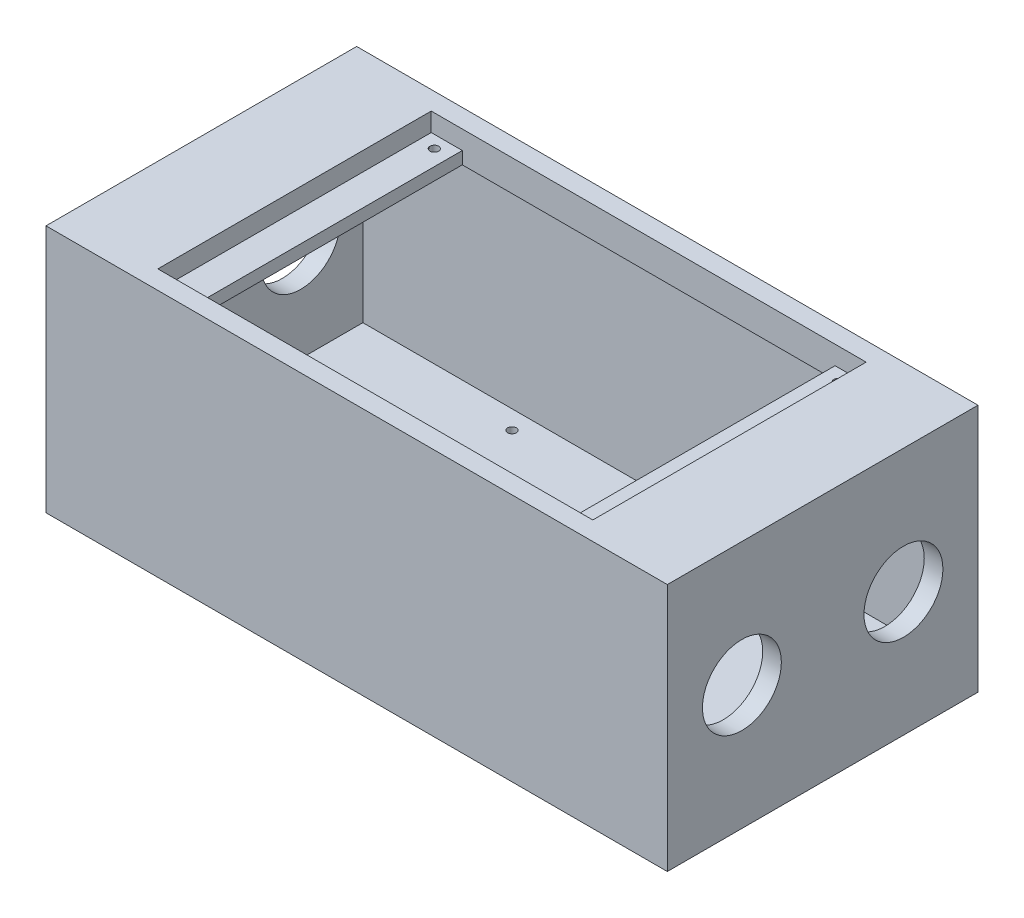
ISO-10303-21;
HEADER;
FILE_DESCRIPTION(('STEP AP214'),'2;1');
FILE_NAME('part.step','',(''),(''),'','','');
FILE_SCHEMA(('AUTOMOTIVE_DESIGN { 1 0 10303 214 1 1 1 1 }'));
ENDSEC;
DATA;
#1=APPLICATION_CONTEXT('core data for automotive mechanical design processes');
#2=APPLICATION_PROTOCOL_DEFINITION('international standard','automotive_design',2000,#1);
#3=PRODUCT_CONTEXT('',#1,'mechanical');
#4=PRODUCT('Part','Part','',(#3));
#5=PRODUCT_RELATED_PRODUCT_CATEGORY('part','',(#4));
#6=PRODUCT_DEFINITION_FORMATION('','',#4);
#7=PRODUCT_DEFINITION_CONTEXT('part definition',#1,'design');
#8=PRODUCT_DEFINITION('design','',#6,#7);
#9=PRODUCT_DEFINITION_SHAPE('','',#8);
#10=(LENGTH_UNIT() NAMED_UNIT(*) SI_UNIT(.MILLI.,.METRE.));
#11=(NAMED_UNIT(*) PLANE_ANGLE_UNIT() SI_UNIT($,.RADIAN.));
#12=(NAMED_UNIT(*) SI_UNIT($,.STERADIAN.) SOLID_ANGLE_UNIT());
#13=UNCERTAINTY_MEASURE_WITH_UNIT(LENGTH_MEASURE(1.E-05),#10,'distance_accuracy_value','');
#14=(GEOMETRIC_REPRESENTATION_CONTEXT(3) GLOBAL_UNCERTAINTY_ASSIGNED_CONTEXT((#13)) GLOBAL_UNIT_ASSIGNED_CONTEXT((#10,
#11,#12)) REPRESENTATION_CONTEXT('',''));
#15=CARTESIAN_POINT('',(0.,0.,0.));
#16=DIRECTION('',(0.,0.,1.));
#17=DIRECTION('',(1.,0.,0.));
#18=AXIS2_PLACEMENT_3D('',#15,#16,#17);
#19=CARTESIAN_POINT('',(0.,85.,0.));
#20=DIRECTION('',(0.,-1.,0.));
#21=DIRECTION('',(0.,0.,-1.));
#22=AXIS2_PLACEMENT_3D('',#19,#20,#21);
#23=PLANE('',#22);
#24=CARTESIAN_POINT('',(162.5,85.,-100.));
#25=DIRECTION('',(0.,-1.,0.));
#26=DIRECTION('',(0.,0.,1.));
#27=AXIS2_PLACEMENT_3D('',#24,#25,#26);
#28=CIRCLE('',#27,3.49999999999999);
#29=CARTESIAN_POINT('',(162.5,85.,-96.5));
#30=VERTEX_POINT('',#29);
#31=EDGE_CURVE('E790',#30,#30,#28,.T.);
#32=ORIENTED_EDGE('',*,*,#31,.T.);
#33=EDGE_LOOP('',(#32));
#34=FACE_BOUND('',#33,.T.);
#35=CARTESIAN_POINT('',(162.5,85.,100.));
#36=DIRECTION('',(0.,1.,0.));
#37=DIRECTION('',(0.,0.,-1.));
#38=AXIS2_PLACEMENT_3D('',#35,#36,#37);
#39=CIRCLE('',#38,3.49999999999999);
#40=CARTESIAN_POINT('',(162.5,85.,96.5));
#41=VERTEX_POINT('',#40);
#42=EDGE_CURVE('E782',#41,#41,#39,.T.);
#43=ORIENTED_EDGE('',*,*,#42,.F.);
#44=EDGE_LOOP('',(#43));
#45=FACE_BOUND('',#44,.T.);
#46=DIRECTION('',(0.,0.,-1.));
#47=VECTOR('',#46,1.);
#48=CARTESIAN_POINT('',(150.,85.,110.));
#49=LINE('',#48,#47);
#50=CARTESIAN_POINT('',(150.,85.,110.));
#51=VERTEX_POINT('',#50);
#52=CARTESIAN_POINT('',(150.,85.,-110.));
#53=VERTEX_POINT('',#52);
#54=EDGE_CURVE('E158',#51,#53,#49,.T.);
#55=ORIENTED_EDGE('',*,*,#54,.F.);
#56=DIRECTION('',(1.,0.,0.));
#57=VECTOR('',#56,1.);
#58=CARTESIAN_POINT('',(-175.,85.,110.));
#59=LINE('',#58,#57);
#60=CARTESIAN_POINT('',(175.,85.,110.));
#61=VERTEX_POINT('',#60);
#62=EDGE_CURVE('E200',#51,#61,#59,.T.);
#63=ORIENTED_EDGE('',*,*,#62,.T.);
#64=DIRECTION('',(0.,0.,-1.));
#65=VECTOR('',#64,1.);
#66=CARTESIAN_POINT('',(175.,85.,110.));
#67=LINE('',#66,#65);
#68=CARTESIAN_POINT('',(175.,85.,-110.));
#69=VERTEX_POINT('',#68);
#70=EDGE_CURVE('E205',#61,#69,#67,.T.);
#71=ORIENTED_EDGE('',*,*,#70,.T.);
#72=DIRECTION('',(-1.,0.,0.));
#73=VECTOR('',#72,1.);
#74=CARTESIAN_POINT('',(-175.,85.,-110.));
#75=LINE('',#74,#73);
#76=EDGE_CURVE('E11',#69,#53,#75,.T.);
#77=ORIENTED_EDGE('',*,*,#76,.T.);
#78=EDGE_LOOP('',(#55,#63,#71,#77));
#79=FACE_BOUND('',#78,.T.);
#80=ADVANCED_FACE('F38',(#34,#45,#79),#23,.F.);
#81=CARTESIAN_POINT('',(-162.5,85.,100.));
#82=DIRECTION('',(0.,-1.,0.));
#83=DIRECTION('',(0.,0.,-1.));
#84=AXIS2_PLACEMENT_3D('',#81,#82,#83);
#85=CIRCLE('',#84,3.49999999999999);
#86=CARTESIAN_POINT('',(-162.5,85.,96.5));
#87=VERTEX_POINT('',#86);
#88=EDGE_CURVE('E774',#87,#87,#85,.T.);
#89=ORIENTED_EDGE('',*,*,#88,.T.);
#90=EDGE_LOOP('',(#89));
#91=FACE_BOUND('',#90,.T.);
#92=CARTESIAN_POINT('',(-162.5,85.,-100.));
#93=DIRECTION('',(0.,1.,0.));
#94=DIRECTION('',(0.,0.,1.));
#95=AXIS2_PLACEMENT_3D('',#92,#93,#94);
#96=CIRCLE('',#95,3.49999999999999);
#97=CARTESIAN_POINT('',(-162.5,85.,-96.5));
#98=VERTEX_POINT('',#97);
#99=EDGE_CURVE('E178',#98,#98,#96,.T.);
#100=ORIENTED_EDGE('',*,*,#99,.F.);
#101=EDGE_LOOP('',(#100));
#102=FACE_BOUND('',#101,.T.);
#103=DIRECTION('',(0.,0.,1.));
#104=VECTOR('',#103,1.);
#105=CARTESIAN_POINT('',(-150.,85.,110.));
#106=LINE('',#105,#104);
#107=CARTESIAN_POINT('',(-150.,85.,-110.));
#108=VERTEX_POINT('',#107);
#109=CARTESIAN_POINT('',(-150.,85.,110.));
#110=VERTEX_POINT('',#109);
#111=EDGE_CURVE('E173',#108,#110,#106,.T.);
#112=ORIENTED_EDGE('',*,*,#111,.F.);
#113=CARTESIAN_POINT('',(-175.,85.,-110.));
#114=VERTEX_POINT('',#113);
#115=EDGE_CURVE('E47',#108,#114,#75,.T.);
#116=ORIENTED_EDGE('',*,*,#115,.T.);
#117=DIRECTION('',(0.,0.,1.));
#118=VECTOR('',#117,1.);
#119=CARTESIAN_POINT('',(-175.,85.,110.));
#120=LINE('',#119,#118);
#121=CARTESIAN_POINT('',(-175.,85.,110.));
#122=VERTEX_POINT('',#121);
#123=EDGE_CURVE('E191',#114,#122,#120,.T.);
#124=ORIENTED_EDGE('',*,*,#123,.T.);
#125=EDGE_CURVE('E201',#122,#110,#59,.T.);
#126=ORIENTED_EDGE('',*,*,#125,.T.);
#127=EDGE_LOOP('',(#112,#116,#124,#126));
#128=FACE_BOUND('',#127,.T.);
#129=ADVANCED_FACE('F377',(#91,#102,#128),#23,.F.);
#130=CARTESIAN_POINT('',(0.,75.,0.));
#131=DIRECTION('',(0.,-1.,0.));
#132=DIRECTION('',(0.,0.,-1.));
#133=AXIS2_PLACEMENT_3D('',#130,#131,#132);
#134=PLANE('',#133);
#135=CARTESIAN_POINT('',(162.5,75.,-100.));
#136=DIRECTION('',(0.,-1.,0.));
#137=DIRECTION('',(0.,0.,1.));
#138=AXIS2_PLACEMENT_3D('',#135,#136,#137);
#139=CIRCLE('',#138,3.49999999999999);
#140=CARTESIAN_POINT('',(162.5,75.,-96.5));
#141=VERTEX_POINT('',#140);
#142=EDGE_CURVE('E786',#141,#141,#139,.T.);
#143=ORIENTED_EDGE('',*,*,#142,.F.);
#144=EDGE_LOOP('',(#143));
#145=FACE_BOUND('',#144,.T.);
#146=CARTESIAN_POINT('',(162.5,75.,100.));
#147=DIRECTION('',(0.,1.,0.));
#148=DIRECTION('',(0.,0.,-1.));
#149=AXIS2_PLACEMENT_3D('',#146,#147,#148);
#150=CIRCLE('',#149,3.49999999999999);
#151=CARTESIAN_POINT('',(162.5,75.,96.5));
#152=VERTEX_POINT('',#151);
#153=EDGE_CURVE('E779',#152,#152,#150,.T.);
#154=ORIENTED_EDGE('',*,*,#153,.T.);
#155=EDGE_LOOP('',(#154));
#156=FACE_BOUND('',#155,.T.);
#157=CARTESIAN_POINT('',(-162.5,75.,100.));
#158=DIRECTION('',(0.,-1.,0.));
#159=DIRECTION('',(0.,0.,-1.));
#160=AXIS2_PLACEMENT_3D('',#157,#158,#159);
#161=CIRCLE('',#160,3.49999999999999);
#162=CARTESIAN_POINT('',(-162.5,75.,96.5));
#163=VERTEX_POINT('',#162);
#164=EDGE_CURVE('E770',#163,#163,#161,.T.);
#165=ORIENTED_EDGE('',*,*,#164,.F.);
#166=EDGE_LOOP('',(#165));
#167=FACE_BOUND('',#166,.T.);
#168=CARTESIAN_POINT('',(-162.5,75.,-100.));
#169=DIRECTION('',(0.,1.,0.));
#170=DIRECTION('',(0.,0.,1.));
#171=AXIS2_PLACEMENT_3D('',#168,#169,#170);
#172=CIRCLE('',#171,3.49999999999999);
#173=CARTESIAN_POINT('',(-162.5,75.,-96.5));
#174=VERTEX_POINT('',#173);
#175=EDGE_CURVE('E186',#174,#174,#172,.T.);
#176=ORIENTED_EDGE('',*,*,#175,.T.);
#177=EDGE_LOOP('',(#176));
#178=FACE_BOUND('',#177,.T.);
#179=DIRECTION('',(0.,0.,-1.));
#180=VECTOR('',#179,1.);
#181=CARTESIAN_POINT('',(235.,75.,115.));
#182=LINE('',#181,#180);
#183=CARTESIAN_POINT('',(235.,75.,115.));
#184=VERTEX_POINT('',#183);
#185=CARTESIAN_POINT('',(235.,75.,-115.));
#186=VERTEX_POINT('',#185);
#187=EDGE_CURVE('E221',#184,#186,#182,.T.);
#188=ORIENTED_EDGE('',*,*,#187,.F.);
#189=DIRECTION('',(1.,0.,0.));
#190=VECTOR('',#189,1.);
#191=CARTESIAN_POINT('',(-235.,75.,115.));
#192=LINE('',#191,#190);
#193=CARTESIAN_POINT('',(-235.,75.,115.));
#194=VERTEX_POINT('',#193);
#195=EDGE_CURVE('E217',#194,#184,#192,.T.);
#196=ORIENTED_EDGE('',*,*,#195,.F.);
#197=DIRECTION('',(0.,0.,1.));
#198=VECTOR('',#197,1.);
#199=CARTESIAN_POINT('',(-235.,75.,115.));
#200=LINE('',#199,#198);
#201=CARTESIAN_POINT('',(-235.,75.,-115.));
#202=VERTEX_POINT('',#201);
#203=EDGE_CURVE('E213',#202,#194,#200,.T.);
#204=ORIENTED_EDGE('',*,*,#203,.F.);
#205=DIRECTION('',(-1.,0.,0.));
#206=VECTOR('',#205,1.);
#207=CARTESIAN_POINT('',(-235.,75.,-115.));
#208=LINE('',#207,#206);
#209=EDGE_CURVE('E209',#186,#202,#208,.T.);
#210=ORIENTED_EDGE('',*,*,#209,.F.);
#211=EDGE_LOOP('',(#188,#196,#204,#210));
#212=FACE_BOUND('',#211,.T.);
#213=DIRECTION('',(1.,0.,0.));
#214=VECTOR('',#213,1.);
#215=CARTESIAN_POINT('',(-150.,75.,110.));
#216=LINE('',#215,#214);
#217=CARTESIAN_POINT('',(-150.,75.,110.));
#218=VERTEX_POINT('',#217);
#219=CARTESIAN_POINT('',(150.,75.,110.));
#220=VERTEX_POINT('',#219);
#221=EDGE_CURVE('E161',#218,#220,#216,.T.);
#222=ORIENTED_EDGE('',*,*,#221,.T.);
#223=DIRECTION('',(0.,0.,-1.));
#224=VECTOR('',#223,1.);
#225=CARTESIAN_POINT('',(150.,75.,110.));
#226=LINE('',#225,#224);
#227=CARTESIAN_POINT('',(150.,75.,-110.));
#228=VERTEX_POINT('',#227);
#229=EDGE_CURVE('E155',#220,#228,#226,.T.);
#230=ORIENTED_EDGE('',*,*,#229,.T.);
#231=DIRECTION('',(-1.,0.,0.));
#232=VECTOR('',#231,1.);
#233=CARTESIAN_POINT('',(-150.,75.,-110.));
#234=LINE('',#233,#232);
#235=CARTESIAN_POINT('',(-150.,75.,-110.));
#236=VERTEX_POINT('',#235);
#237=EDGE_CURVE('E164',#228,#236,#234,.T.);
#238=ORIENTED_EDGE('',*,*,#237,.T.);
#239=DIRECTION('',(0.,0.,1.));
#240=VECTOR('',#239,1.);
#241=CARTESIAN_POINT('',(-150.,75.,110.));
#242=LINE('',#241,#240);
#243=EDGE_CURVE('E59',#236,#218,#242,.T.);
#244=ORIENTED_EDGE('',*,*,#243,.T.);
#245=EDGE_LOOP('',(#222,#230,#238,#244));
#246=FACE_BOUND('',#245,.T.);
#247=ADVANCED_FACE('F170',(#145,#156,#167,#178,#212,#246),#134,.T.);
#248=CARTESIAN_POINT('',(175.,80.,110.));
#249=DIRECTION('',(1.,0.,0.));
#250=DIRECTION('',(0.,0.,-1.));
#251=AXIS2_PLACEMENT_3D('',#248,#249,#250);
#252=PLANE('',#251);
#253=ORIENTED_EDGE('',*,*,#70,.F.);
#254=DIRECTION('',(0.,1.,0.));
#255=VECTOR('',#254,1.);
#256=CARTESIAN_POINT('',(175.,80.,110.));
#257=LINE('',#256,#255);
#258=CARTESIAN_POINT('',(175.,100.,110.));
#259=VERTEX_POINT('',#258);
#260=EDGE_CURVE('E242',#61,#259,#257,.T.);
#261=ORIENTED_EDGE('',*,*,#260,.T.);
#262=DIRECTION('',(0.,0.,-1.));
#263=VECTOR('',#262,1.);
#264=CARTESIAN_POINT('',(175.,100.,110.));
#265=LINE('',#264,#263);
#266=CARTESIAN_POINT('',(175.,100.,-110.));
#267=VERTEX_POINT('',#266);
#268=EDGE_CURVE('E225',#259,#267,#265,.T.);
#269=ORIENTED_EDGE('',*,*,#268,.T.);
#270=DIRECTION('',(0.,1.,0.));
#271=VECTOR('',#270,1.);
#272=CARTESIAN_POINT('',(175.,80.,-110.));
#273=LINE('',#272,#271);
#274=EDGE_CURVE('E241',#69,#267,#273,.T.);
#275=ORIENTED_EDGE('',*,*,#274,.F.);
#276=EDGE_LOOP('',(#253,#261,#269,#275));
#277=FACE_BOUND('',#276,.T.);
#278=ADVANCED_FACE('F392',(#277),#252,.F.);
#279=CARTESIAN_POINT('',(-175.,80.,110.));
#280=DIRECTION('',(0.,0.,1.));
#281=DIRECTION('',(1.,0.,0.));
#282=AXIS2_PLACEMENT_3D('',#279,#280,#281);
#283=PLANE('',#282);
#284=ORIENTED_EDGE('',*,*,#125,.F.);
#285=DIRECTION('',(0.,1.,0.));
#286=VECTOR('',#285,1.);
#287=CARTESIAN_POINT('',(-175.,80.,110.));
#288=LINE('',#287,#286);
#289=CARTESIAN_POINT('',(-175.,100.,110.));
#290=VERTEX_POINT('',#289);
#291=EDGE_CURVE('E246',#122,#290,#288,.T.);
#292=ORIENTED_EDGE('',*,*,#291,.T.);
#293=DIRECTION('',(1.,0.,0.));
#294=VECTOR('',#293,1.);
#295=CARTESIAN_POINT('',(-175.,100.,110.));
#296=LINE('',#295,#294);
#297=EDGE_CURVE('E237',#290,#259,#296,.T.);
#298=ORIENTED_EDGE('',*,*,#297,.T.);
#299=ORIENTED_EDGE('',*,*,#260,.F.);
#300=ORIENTED_EDGE('',*,*,#62,.F.);
#301=DIRECTION('',(0.,1.,0.));
#302=VECTOR('',#301,1.);
#303=CARTESIAN_POINT('',(150.,75.,110.));
#304=LINE('',#303,#302);
#305=EDGE_CURVE('E188',#220,#51,#304,.T.);
#306=ORIENTED_EDGE('',*,*,#305,.F.);
#307=ORIENTED_EDGE('',*,*,#221,.F.);
#308=DIRECTION('',(0.,1.,0.));
#309=VECTOR('',#308,1.);
#310=CARTESIAN_POINT('',(-150.,75.,110.));
#311=LINE('',#310,#309);
#312=EDGE_CURVE('E192',#218,#110,#311,.T.);
#313=ORIENTED_EDGE('',*,*,#312,.T.);
#314=EDGE_LOOP('',(#284,#292,#298,#299,#300,#306,#307,#313));
#315=FACE_BOUND('',#314,.T.);
#316=ADVANCED_FACE('F394',(#315),#283,.F.);
#317=CARTESIAN_POINT('',(-175.,80.,110.));
#318=DIRECTION('',(-1.,0.,0.));
#319=DIRECTION('',(0.,0.,1.));
#320=AXIS2_PLACEMENT_3D('',#317,#318,#319);
#321=PLANE('',#320);
#322=ORIENTED_EDGE('',*,*,#123,.F.);
#323=DIRECTION('',(0.,1.,0.));
#324=VECTOR('',#323,1.);
#325=CARTESIAN_POINT('',(-175.,80.,-110.));
#326=LINE('',#325,#324);
#327=CARTESIAN_POINT('',(-175.,100.,-110.));
#328=VERTEX_POINT('',#327);
#329=EDGE_CURVE('E249',#114,#328,#326,.T.);
#330=ORIENTED_EDGE('',*,*,#329,.T.);
#331=DIRECTION('',(0.,0.,1.));
#332=VECTOR('',#331,1.);
#333=CARTESIAN_POINT('',(-175.,100.,110.));
#334=LINE('',#333,#332);
#335=EDGE_CURVE('E233',#328,#290,#334,.T.);
#336=ORIENTED_EDGE('',*,*,#335,.T.);
#337=ORIENTED_EDGE('',*,*,#291,.F.);
#338=EDGE_LOOP('',(#322,#330,#336,#337));
#339=FACE_BOUND('',#338,.T.);
#340=ADVANCED_FACE('F397',(#339),#321,.F.);
#341=CARTESIAN_POINT('',(-175.,80.,-110.));
#342=DIRECTION('',(0.,0.,-1.));
#343=DIRECTION('',(-1.,0.,0.));
#344=AXIS2_PLACEMENT_3D('',#341,#342,#343);
#345=PLANE('',#344);
#346=ORIENTED_EDGE('',*,*,#76,.F.);
#347=ORIENTED_EDGE('',*,*,#274,.T.);
#348=DIRECTION('',(-1.,0.,0.));
#349=VECTOR('',#348,1.);
#350=CARTESIAN_POINT('',(-175.,100.,-110.));
#351=LINE('',#350,#349);
#352=EDGE_CURVE('E229',#267,#328,#351,.T.);
#353=ORIENTED_EDGE('',*,*,#352,.T.);
#354=ORIENTED_EDGE('',*,*,#329,.F.);
#355=ORIENTED_EDGE('',*,*,#115,.F.);
#356=DIRECTION('',(0.,1.,0.));
#357=VECTOR('',#356,1.);
#358=CARTESIAN_POINT('',(-150.,75.,-110.));
#359=LINE('',#358,#357);
#360=EDGE_CURVE('E54',#236,#108,#359,.T.);
#361=ORIENTED_EDGE('',*,*,#360,.F.);
#362=ORIENTED_EDGE('',*,*,#237,.F.);
#363=DIRECTION('',(0.,1.,0.));
#364=VECTOR('',#363,1.);
#365=CARTESIAN_POINT('',(150.,75.,-110.));
#366=LINE('',#365,#364);
#367=EDGE_CURVE('E151',#228,#53,#366,.T.);
#368=ORIENTED_EDGE('',*,*,#367,.T.);
#369=EDGE_LOOP('',(#346,#347,#353,#354,#355,#361,#362,#368));
#370=FACE_BOUND('',#369,.T.);
#371=ADVANCED_FACE('F165',(#370),#345,.F.);
#372=CARTESIAN_POINT('',(235.,-80.,115.));
#373=DIRECTION('',(1.,0.,0.));
#374=DIRECTION('',(0.,0.,-1.));
#375=AXIS2_PLACEMENT_3D('',#372,#373,#374);
#376=PLANE('',#375);
#377=CARTESIAN_POINT('',(235.,0.,-64.9999999999999));
#378=DIRECTION('',(1.,0.,0.));
#379=DIRECTION('',(0.,0.,-1.));
#380=AXIS2_PLACEMENT_3D('',#377,#378,#379);
#381=CIRCLE('',#380,31.75);
#382=CARTESIAN_POINT('',(235.,0.,-96.7499999999999));
#383=VERTEX_POINT('',#382);
#384=EDGE_CURVE('E273',#383,#383,#381,.F.);
#385=ORIENTED_EDGE('',*,*,#384,.F.);
#386=EDGE_LOOP('',(#385));
#387=FACE_BOUND('',#386,.T.);
#388=CARTESIAN_POINT('',(235.,0.,64.9999999999999));
#389=DIRECTION('',(1.,0.,0.));
#390=DIRECTION('',(0.,0.,-1.));
#391=AXIS2_PLACEMENT_3D('',#388,#389,#390);
#392=CIRCLE('',#391,31.75);
#393=CARTESIAN_POINT('',(235.,0.,33.2499999999999));
#394=VERTEX_POINT('',#393);
#395=EDGE_CURVE('E281',#394,#394,#392,.T.);
#396=ORIENTED_EDGE('',*,*,#395,.T.);
#397=EDGE_LOOP('',(#396));
#398=FACE_BOUND('',#397,.T.);
#399=DIRECTION('',(0.,1.,0.));
#400=VECTOR('',#399,1.);
#401=CARTESIAN_POINT('',(235.,-80.,115.));
#402=LINE('',#401,#400);
#403=CARTESIAN_POINT('',(235.,-80.,115.));
#404=VERTEX_POINT('',#403);
#405=EDGE_CURVE('E299',#404,#184,#402,.T.);
#406=ORIENTED_EDGE('',*,*,#405,.T.);
#407=ORIENTED_EDGE('',*,*,#187,.T.);
#408=DIRECTION('',(0.,1.,0.));
#409=VECTOR('',#408,1.);
#410=CARTESIAN_POINT('',(235.,-80.,-115.));
#411=LINE('',#410,#409);
#412=CARTESIAN_POINT('',(235.,-80.,-115.));
#413=VERTEX_POINT('',#412);
#414=EDGE_CURVE('E298',#413,#186,#411,.T.);
#415=ORIENTED_EDGE('',*,*,#414,.F.);
#416=DIRECTION('',(0.,0.,-1.));
#417=VECTOR('',#416,1.);
#418=CARTESIAN_POINT('',(235.,-80.,115.));
#419=LINE('',#418,#417);
#420=EDGE_CURVE('E282',#404,#413,#419,.T.);
#421=ORIENTED_EDGE('',*,*,#420,.F.);
#422=EDGE_LOOP('',(#406,#407,#415,#421));
#423=FACE_BOUND('',#422,.T.);
#424=ADVANCED_FACE('F357',(#387,#398,#423),#376,.F.);
#425=CARTESIAN_POINT('',(-235.,-80.,115.));
#426=DIRECTION('',(0.,0.,1.));
#427=DIRECTION('',(1.,0.,0.));
#428=AXIS2_PLACEMENT_3D('',#425,#426,#427);
#429=PLANE('',#428);
#430=DIRECTION('',(0.,1.,0.));
#431=VECTOR('',#430,1.);
#432=CARTESIAN_POINT('',(-235.,-80.,115.));
#433=LINE('',#432,#431);
#434=CARTESIAN_POINT('',(-235.,-80.,115.));
#435=VERTEX_POINT('',#434);
#436=EDGE_CURVE('E304',#435,#194,#433,.T.);
#437=ORIENTED_EDGE('',*,*,#436,.T.);
#438=ORIENTED_EDGE('',*,*,#195,.T.);
#439=ORIENTED_EDGE('',*,*,#405,.F.);
#440=DIRECTION('',(1.,0.,0.));
#441=VECTOR('',#440,1.);
#442=CARTESIAN_POINT('',(-235.,-80.,115.));
#443=LINE('',#442,#441);
#444=EDGE_CURVE('E294',#435,#404,#443,.T.);
#445=ORIENTED_EDGE('',*,*,#444,.F.);
#446=EDGE_LOOP('',(#437,#438,#439,#445));
#447=FACE_BOUND('',#446,.T.);
#448=ADVANCED_FACE('F429',(#447),#429,.F.);
#449=CARTESIAN_POINT('',(-235.,-80.,115.));
#450=DIRECTION('',(-1.,0.,0.));
#451=DIRECTION('',(0.,0.,1.));
#452=AXIS2_PLACEMENT_3D('',#449,#450,#451);
#453=PLANE('',#452);
#454=CARTESIAN_POINT('',(-235.,0.,64.9999999999999));
#455=DIRECTION('',(-1.,0.,0.));
#456=DIRECTION('',(0.,0.,1.));
#457=AXIS2_PLACEMENT_3D('',#454,#455,#456);
#458=CIRCLE('',#457,31.75);
#459=CARTESIAN_POINT('',(-235.,0.,96.7499999999999));
#460=VERTEX_POINT('',#459);
#461=EDGE_CURVE('E257',#460,#460,#458,.F.);
#462=ORIENTED_EDGE('',*,*,#461,.F.);
#463=EDGE_LOOP('',(#462));
#464=FACE_BOUND('',#463,.T.);
#465=CARTESIAN_POINT('',(-235.,0.,-64.9999999999999));
#466=DIRECTION('',(-1.,0.,0.));
#467=DIRECTION('',(0.,0.,1.));
#468=AXIS2_PLACEMENT_3D('',#465,#466,#467);
#469=CIRCLE('',#468,31.75);
#470=CARTESIAN_POINT('',(-235.,0.,-33.2499999999999));
#471=VERTEX_POINT('',#470);
#472=EDGE_CURVE('E265',#471,#471,#469,.T.);
#473=ORIENTED_EDGE('',*,*,#472,.T.);
#474=EDGE_LOOP('',(#473));
#475=FACE_BOUND('',#474,.T.);
#476=DIRECTION('',(0.,1.,0.));
#477=VECTOR('',#476,1.);
#478=CARTESIAN_POINT('',(-235.,-80.,-115.));
#479=LINE('',#478,#477);
#480=CARTESIAN_POINT('',(-235.,-80.,-115.));
#481=VERTEX_POINT('',#480);
#482=EDGE_CURVE('E308',#481,#202,#479,.T.);
#483=ORIENTED_EDGE('',*,*,#482,.T.);
#484=ORIENTED_EDGE('',*,*,#203,.T.);
#485=ORIENTED_EDGE('',*,*,#436,.F.);
#486=DIRECTION('',(0.,0.,1.));
#487=VECTOR('',#486,1.);
#488=CARTESIAN_POINT('',(-235.,-80.,115.));
#489=LINE('',#488,#487);
#490=EDGE_CURVE('E290',#481,#435,#489,.T.);
#491=ORIENTED_EDGE('',*,*,#490,.F.);
#492=EDGE_LOOP('',(#483,#484,#485,#491));
#493=FACE_BOUND('',#492,.T.);
#494=ADVANCED_FACE('F434',(#464,#475,#493),#453,.F.);
#495=CARTESIAN_POINT('',(-235.,-80.,-115.));
#496=DIRECTION('',(0.,0.,-1.));
#497=DIRECTION('',(-1.,0.,0.));
#498=AXIS2_PLACEMENT_3D('',#495,#496,#497);
#499=PLANE('',#498);
#500=ORIENTED_EDGE('',*,*,#414,.T.);
#501=ORIENTED_EDGE('',*,*,#209,.T.);
#502=ORIENTED_EDGE('',*,*,#482,.F.);
#503=DIRECTION('',(-1.,0.,0.));
#504=VECTOR('',#503,1.);
#505=CARTESIAN_POINT('',(-235.,-80.,-115.));
#506=LINE('',#505,#504);
#507=EDGE_CURVE('E286',#413,#481,#506,.T.);
#508=ORIENTED_EDGE('',*,*,#507,.F.);
#509=EDGE_LOOP('',(#500,#501,#502,#508));
#510=FACE_BOUND('',#509,.T.);
#511=ADVANCED_FACE('F372',(#510),#499,.F.);
#512=CARTESIAN_POINT('',(0.,-80.,0.));
#513=DIRECTION('',(0.,-1.,0.));
#514=DIRECTION('',(0.,0.,-1.));
#515=AXIS2_PLACEMENT_3D('',#512,#513,#514);
#516=PLANE('',#515);
#517=CARTESIAN_POINT('',(100.,-80.,-100.));
#518=DIRECTION('',(0.,-1.,0.));
#519=DIRECTION('',(0.,0.,1.));
#520=AXIS2_PLACEMENT_3D('',#517,#518,#519);
#521=CIRCLE('',#520,3.50000000000001);
#522=CARTESIAN_POINT('',(100.,-80.,-96.5));
#523=VERTEX_POINT('',#522);
#524=EDGE_CURVE('E821',#523,#523,#521,.T.);
#525=ORIENTED_EDGE('',*,*,#524,.T.);
#526=EDGE_LOOP('',(#525));
#527=FACE_BOUND('',#526,.T.);
#528=CARTESIAN_POINT('',(100.,-80.,100.));
#529=DIRECTION('',(0.,1.,0.));
#530=DIRECTION('',(0.,0.,-1.));
#531=AXIS2_PLACEMENT_3D('',#528,#529,#530);
#532=CIRCLE('',#531,3.50000000000001);
#533=CARTESIAN_POINT('',(100.,-80.,96.5));
#534=VERTEX_POINT('',#533);
#535=EDGE_CURVE('E813',#534,#534,#532,.T.);
#536=ORIENTED_EDGE('',*,*,#535,.F.);
#537=EDGE_LOOP('',(#536));
#538=FACE_BOUND('',#537,.T.);
#539=CARTESIAN_POINT('',(-100.,-80.,100.));
#540=DIRECTION('',(0.,-1.,0.));
#541=DIRECTION('',(0.,0.,-1.));
#542=AXIS2_PLACEMENT_3D('',#539,#540,#541);
#543=CIRCLE('',#542,3.50000000000001);
#544=CARTESIAN_POINT('',(-100.,-80.,96.5));
#545=VERTEX_POINT('',#544);
#546=EDGE_CURVE('E805',#545,#545,#543,.T.);
#547=ORIENTED_EDGE('',*,*,#546,.T.);
#548=EDGE_LOOP('',(#547));
#549=FACE_BOUND('',#548,.T.);
#550=CARTESIAN_POINT('',(-100.,-80.,-100.));
#551=DIRECTION('',(0.,1.,0.));
#552=DIRECTION('',(0.,0.,1.));
#553=AXIS2_PLACEMENT_3D('',#550,#551,#552);
#554=CIRCLE('',#553,3.50000000000001);
#555=CARTESIAN_POINT('',(-100.,-80.,-96.5));
#556=VERTEX_POINT('',#555);
#557=EDGE_CURVE('E797',#556,#556,#554,.T.);
#558=ORIENTED_EDGE('',*,*,#557,.F.);
#559=EDGE_LOOP('',(#558));
#560=FACE_BOUND('',#559,.T.);
#561=ORIENTED_EDGE('',*,*,#420,.T.);
#562=ORIENTED_EDGE('',*,*,#507,.T.);
#563=ORIENTED_EDGE('',*,*,#490,.T.);
#564=ORIENTED_EDGE('',*,*,#444,.T.);
#565=EDGE_LOOP('',(#561,#562,#563,#564));
#566=FACE_BOUND('',#565,.T.);
#567=ADVANCED_FACE('F362',(#527,#538,#549,#560,#566),#516,.F.);
#568=CARTESIAN_POINT('',(230.,0.,64.9999999999999));
#569=DIRECTION('',(1.,0.,0.));
#570=DIRECTION('',(0.,0.,-1.));
#571=AXIS2_PLACEMENT_3D('',#568,#569,#570);
#572=CYLINDRICAL_SURFACE('',#571,31.75);
#573=CARTESIAN_POINT('',(250.,0.,64.9999999999999));
#574=DIRECTION('',(1.,0.,0.));
#575=DIRECTION('',(0.,0.,-1.));
#576=AXIS2_PLACEMENT_3D('',#573,#574,#575);
#577=CIRCLE('',#576,31.75);
#578=CARTESIAN_POINT('',(250.,0.,33.2499999999999));
#579=VERTEX_POINT('',#578);
#580=EDGE_CURVE('E277',#579,#579,#577,.T.);
#581=ORIENTED_EDGE('',*,*,#580,.T.);
#582=EDGE_LOOP('',(#581));
#583=FACE_BOUND('',#582,.T.);
#584=ORIENTED_EDGE('',*,*,#395,.F.);
#585=EDGE_LOOP('',(#584));
#586=FACE_BOUND('',#585,.T.);
#587=ADVANCED_FACE('F360',(#583,#586),#572,.F.);
#588=CARTESIAN_POINT('',(250.,-100.,-125.));
#589=DIRECTION('',(0.,0.,1.));
#590=DIRECTION('',(1.,0.,0.));
#591=AXIS2_PLACEMENT_3D('',#588,#589,#590);
#592=PLANE('',#591);
#593=DIRECTION('',(0.,1.,0.));
#594=VECTOR('',#593,1.);
#595=CARTESIAN_POINT('',(-250.,-100.,-125.));
#596=LINE('',#595,#594);
#597=CARTESIAN_POINT('',(-250.,-100.,-125.));
#598=VERTEX_POINT('',#597);
#599=CARTESIAN_POINT('',(-250.,100.,-125.));
#600=VERTEX_POINT('',#599);
#601=EDGE_CURVE('E303',#598,#600,#596,.T.);
#602=ORIENTED_EDGE('',*,*,#601,.T.);
#603=DIRECTION('',(-1.,0.,0.));
#604=VECTOR('',#603,1.);
#605=CARTESIAN_POINT('',(250.,100.,-125.));
#606=LINE('',#605,#604);
#607=CARTESIAN_POINT('',(250.,100.,-125.));
#608=VERTEX_POINT('',#607);
#609=EDGE_CURVE('E350',#608,#600,#606,.T.);
#610=ORIENTED_EDGE('',*,*,#609,.F.);
#611=DIRECTION('',(0.,1.,0.));
#612=VECTOR('',#611,1.);
#613=CARTESIAN_POINT('',(250.,-100.,-125.));
#614=LINE('',#613,#612);
#615=CARTESIAN_POINT('',(250.,-100.,-125.));
#616=VERTEX_POINT('',#615);
#617=EDGE_CURVE('E315',#616,#608,#614,.T.);
#618=ORIENTED_EDGE('',*,*,#617,.F.);
#619=DIRECTION('',(-1.,0.,0.));
#620=VECTOR('',#619,1.);
#621=CARTESIAN_POINT('',(250.,-100.,-125.));
#622=LINE('',#621,#620);
#623=EDGE_CURVE('E328',#616,#598,#622,.T.);
#624=ORIENTED_EDGE('',*,*,#623,.T.);
#625=EDGE_LOOP('',(#602,#610,#618,#624));
#626=FACE_BOUND('',#625,.T.);
#627=ADVANCED_FACE('F40',(#626),#592,.F.);
#628=CARTESIAN_POINT('',(250.,100.,125.));
#629=DIRECTION('',(0.,-1.,0.));
#630=DIRECTION('',(0.,0.,-1.));
#631=AXIS2_PLACEMENT_3D('',#628,#629,#630);
#632=PLANE('',#631);
#633=ORIENTED_EDGE('',*,*,#352,.F.);
#634=ORIENTED_EDGE('',*,*,#268,.F.);
#635=ORIENTED_EDGE('',*,*,#297,.F.);
#636=ORIENTED_EDGE('',*,*,#335,.F.);
#637=EDGE_LOOP('',(#633,#634,#635,#636));
#638=FACE_BOUND('',#637,.T.);
#639=DIRECTION('',(0.,0.,1.));
#640=VECTOR('',#639,1.);
#641=CARTESIAN_POINT('',(-250.,100.,125.));
#642=LINE('',#641,#640);
#643=CARTESIAN_POINT('',(-250.,100.,125.));
#644=VERTEX_POINT('',#643);
#645=EDGE_CURVE('E331',#600,#644,#642,.T.);
#646=ORIENTED_EDGE('',*,*,#645,.T.);
#647=DIRECTION('',(-1.,0.,0.));
#648=VECTOR('',#647,1.);
#649=CARTESIAN_POINT('',(250.,100.,125.));
#650=LINE('',#649,#648);
#651=CARTESIAN_POINT('',(250.,100.,125.));
#652=VERTEX_POINT('',#651);
#653=EDGE_CURVE('E346',#652,#644,#650,.T.);
#654=ORIENTED_EDGE('',*,*,#653,.F.);
#655=DIRECTION('',(0.,0.,1.));
#656=VECTOR('',#655,1.);
#657=CARTESIAN_POINT('',(250.,100.,125.));
#658=LINE('',#657,#656);
#659=EDGE_CURVE('E318',#608,#652,#658,.T.);
#660=ORIENTED_EDGE('',*,*,#659,.F.);
#661=ORIENTED_EDGE('',*,*,#609,.T.);
#662=EDGE_LOOP('',(#646,#654,#660,#661));
#663=FACE_BOUND('',#662,.T.);
#664=ADVANCED_FACE('F369',(#638,#663),#632,.F.);
#665=CARTESIAN_POINT('',(250.,-100.,125.));
#666=DIRECTION('',(0.,0.,-1.));
#667=DIRECTION('',(-1.,0.,0.));
#668=AXIS2_PLACEMENT_3D('',#665,#666,#667);
#669=PLANE('',#668);
#670=DIRECTION('',(-1.,0.,0.));
#671=VECTOR('',#670,1.);
#672=CARTESIAN_POINT('',(250.,-100.,125.));
#673=LINE('',#672,#671);
#674=CARTESIAN_POINT('',(250.,-100.,125.));
#675=VERTEX_POINT('',#674);
#676=CARTESIAN_POINT('',(-250.,-100.,125.));
#677=VERTEX_POINT('',#676);
#678=EDGE_CURVE('E342',#675,#677,#673,.T.);
#679=ORIENTED_EDGE('',*,*,#678,.F.);
#680=DIRECTION('',(0.,-1.,0.));
#681=VECTOR('',#680,1.);
#682=CARTESIAN_POINT('',(250.,-100.,125.));
#683=LINE('',#682,#681);
#684=EDGE_CURVE('E322',#652,#675,#683,.T.);
#685=ORIENTED_EDGE('',*,*,#684,.F.);
#686=ORIENTED_EDGE('',*,*,#653,.T.);
#687=DIRECTION('',(0.,-1.,0.));
#688=VECTOR('',#687,1.);
#689=CARTESIAN_POINT('',(-250.,-100.,125.));
#690=LINE('',#689,#688);
#691=EDGE_CURVE('E334',#644,#677,#690,.T.);
#692=ORIENTED_EDGE('',*,*,#691,.T.);
#693=EDGE_LOOP('',(#679,#685,#686,#692));
#694=FACE_BOUND('',#693,.T.);
#695=ADVANCED_FACE('F446',(#694),#669,.F.);
#696=CARTESIAN_POINT('',(250.,-100.,125.));
#697=DIRECTION('',(0.,1.,0.));
#698=DIRECTION('',(0.,0.,1.));
#699=AXIS2_PLACEMENT_3D('',#696,#697,#698);
#700=PLANE('',#699);
#701=DIRECTION('',(0.,0.,-1.));
#702=VECTOR('',#701,1.);
#703=CARTESIAN_POINT('',(-250.,-100.,125.));
#704=LINE('',#703,#702);
#705=EDGE_CURVE('E319',#677,#598,#704,.T.);
#706=ORIENTED_EDGE('',*,*,#705,.T.);
#707=ORIENTED_EDGE('',*,*,#623,.F.);
#708=DIRECTION('',(0.,0.,-1.));
#709=VECTOR('',#708,1.);
#710=CARTESIAN_POINT('',(250.,-100.,125.));
#711=LINE('',#710,#709);
#712=EDGE_CURVE('E325',#675,#616,#711,.T.);
#713=ORIENTED_EDGE('',*,*,#712,.F.);
#714=ORIENTED_EDGE('',*,*,#678,.T.);
#715=EDGE_LOOP('',(#706,#707,#713,#714));
#716=FACE_BOUND('',#715,.T.);
#717=ADVANCED_FACE('F441',(#716),#700,.F.);
#718=CARTESIAN_POINT('',(250.,0.,0.));
#719=DIRECTION('',(-1.,0.,0.));
#720=DIRECTION('',(0.,0.,1.));
#721=AXIS2_PLACEMENT_3D('',#718,#719,#720);
#722=PLANE('',#721);
#723=CARTESIAN_POINT('',(250.,0.,-64.9999999999999));
#724=DIRECTION('',(-1.,0.,0.));
#725=DIRECTION('',(0.,0.,1.));
#726=AXIS2_PLACEMENT_3D('',#723,#724,#725);
#727=CIRCLE('',#726,31.75);
#728=CARTESIAN_POINT('',(250.,0.,-33.2499999999999));
#729=VERTEX_POINT('',#728);
#730=EDGE_CURVE('E269',#729,#729,#727,.T.);
#731=ORIENTED_EDGE('',*,*,#730,.T.);
#732=EDGE_LOOP('',(#731));
#733=FACE_BOUND('',#732,.T.);
#734=ORIENTED_EDGE('',*,*,#580,.F.);
#735=EDGE_LOOP('',(#734));
#736=FACE_BOUND('',#735,.T.);
#737=ORIENTED_EDGE('',*,*,#617,.T.);
#738=ORIENTED_EDGE('',*,*,#659,.T.);
#739=ORIENTED_EDGE('',*,*,#684,.T.);
#740=ORIENTED_EDGE('',*,*,#712,.T.);
#741=EDGE_LOOP('',(#737,#738,#739,#740));
#742=FACE_BOUND('',#741,.T.);
#743=ADVANCED_FACE('F421',(#733,#736,#742),#722,.F.);
#744=CARTESIAN_POINT('',(-250.,0.,0.));
#745=DIRECTION('',(-1.,0.,0.));
#746=DIRECTION('',(0.,0.,1.));
#747=AXIS2_PLACEMENT_3D('',#744,#745,#746);
#748=PLANE('',#747);
#749=ORIENTED_EDGE('',*,*,#705,.F.);
#750=ORIENTED_EDGE('',*,*,#691,.F.);
#751=ORIENTED_EDGE('',*,*,#645,.F.);
#752=ORIENTED_EDGE('',*,*,#601,.F.);
#753=EDGE_LOOP('',(#749,#750,#751,#752));
#754=FACE_BOUND('',#753,.T.);
#755=CARTESIAN_POINT('',(-250.,0.,64.9999999999999));
#756=DIRECTION('',(1.,0.,0.));
#757=DIRECTION('',(0.,0.,-1.));
#758=AXIS2_PLACEMENT_3D('',#755,#756,#757);
#759=CIRCLE('',#758,31.75);
#760=CARTESIAN_POINT('',(-250.,0.,33.2499999999999));
#761=VERTEX_POINT('',#760);
#762=EDGE_CURVE('E245',#761,#761,#759,.T.);
#763=ORIENTED_EDGE('',*,*,#762,.T.);
#764=EDGE_LOOP('',(#763));
#765=FACE_BOUND('',#764,.T.);
#766=CARTESIAN_POINT('',(-250.,0.,-64.9999999999999));
#767=DIRECTION('',(-1.,0.,0.));
#768=DIRECTION('',(0.,0.,1.));
#769=AXIS2_PLACEMENT_3D('',#766,#767,#768);
#770=CIRCLE('',#769,31.75);
#771=CARTESIAN_POINT('',(-250.,0.,-33.2499999999999));
#772=VERTEX_POINT('',#771);
#773=EDGE_CURVE('E261',#772,#772,#770,.T.);
#774=ORIENTED_EDGE('',*,*,#773,.F.);
#775=EDGE_LOOP('',(#774));
#776=FACE_BOUND('',#775,.T.);
#777=ADVANCED_FACE('F416',(#754,#765,#776),#748,.T.);
#778=CARTESIAN_POINT('',(230.,0.,-64.9999999999999));
#779=DIRECTION('',(1.,0.,0.));
#780=DIRECTION('',(0.,0.,-1.));
#781=AXIS2_PLACEMENT_3D('',#778,#779,#780);
#782=CYLINDRICAL_SURFACE('',#781,31.75);
#783=ORIENTED_EDGE('',*,*,#730,.F.);
#784=EDGE_LOOP('',(#783));
#785=FACE_BOUND('',#784,.T.);
#786=ORIENTED_EDGE('',*,*,#384,.T.);
#787=EDGE_LOOP('',(#786));
#788=FACE_BOUND('',#787,.T.);
#789=ADVANCED_FACE('F413',(#785,#788),#782,.F.);
#790=CARTESIAN_POINT('',(-230.,0.,-64.9999999999999));
#791=DIRECTION('',(-1.,0.,0.));
#792=DIRECTION('',(0.,0.,1.));
#793=AXIS2_PLACEMENT_3D('',#790,#791,#792);
#794=CYLINDRICAL_SURFACE('',#793,31.75);
#795=ORIENTED_EDGE('',*,*,#773,.T.);
#796=EDGE_LOOP('',(#795));
#797=FACE_BOUND('',#796,.T.);
#798=ORIENTED_EDGE('',*,*,#472,.F.);
#799=EDGE_LOOP('',(#798));
#800=FACE_BOUND('',#799,.T.);
#801=ADVANCED_FACE('F410',(#797,#800),#794,.F.);
#802=CARTESIAN_POINT('',(-230.,0.,64.9999999999999));
#803=DIRECTION('',(-1.,0.,0.));
#804=DIRECTION('',(0.,0.,1.));
#805=AXIS2_PLACEMENT_3D('',#802,#803,#804);
#806=CYLINDRICAL_SURFACE('',#805,31.75);
#807=ORIENTED_EDGE('',*,*,#762,.F.);
#808=EDGE_LOOP('',(#807));
#809=FACE_BOUND('',#808,.T.);
#810=ORIENTED_EDGE('',*,*,#461,.T.);
#811=EDGE_LOOP('',(#810));
#812=FACE_BOUND('',#811,.T.);
#813=ADVANCED_FACE('F407',(#809,#812),#806,.F.);
#814=CARTESIAN_POINT('',(150.,75.,110.));
#815=DIRECTION('',(1.,0.,0.));
#816=DIRECTION('',(0.,0.,-1.));
#817=AXIS2_PLACEMENT_3D('',#814,#815,#816);
#818=PLANE('',#817);
#819=ORIENTED_EDGE('',*,*,#54,.T.);
#820=ORIENTED_EDGE('',*,*,#367,.F.);
#821=ORIENTED_EDGE('',*,*,#229,.F.);
#822=ORIENTED_EDGE('',*,*,#305,.T.);
#823=EDGE_LOOP('',(#819,#820,#821,#822));
#824=FACE_BOUND('',#823,.T.);
#825=ADVANCED_FACE('F153',(#824),#818,.F.);
#826=CARTESIAN_POINT('',(-150.,75.,110.));
#827=DIRECTION('',(-1.,0.,0.));
#828=DIRECTION('',(0.,0.,1.));
#829=AXIS2_PLACEMENT_3D('',#826,#827,#828);
#830=PLANE('',#829);
#831=ORIENTED_EDGE('',*,*,#111,.T.);
#832=ORIENTED_EDGE('',*,*,#312,.F.);
#833=ORIENTED_EDGE('',*,*,#243,.F.);
#834=ORIENTED_EDGE('',*,*,#360,.T.);
#835=EDGE_LOOP('',(#831,#832,#833,#834));
#836=FACE_BOUND('',#835,.T.);
#837=ADVANCED_FACE('F578',(#836),#830,.F.);
#838=CARTESIAN_POINT('',(-162.5,75.,-100.));
#839=DIRECTION('',(0.,1.,0.));
#840=DIRECTION('',(0.,0.,1.));
#841=AXIS2_PLACEMENT_3D('',#838,#839,#840);
#842=CYLINDRICAL_SURFACE('',#841,3.49999999999999);
#843=ORIENTED_EDGE('',*,*,#175,.F.);
#844=EDGE_LOOP('',(#843));
#845=FACE_BOUND('',#844,.T.);
#846=ORIENTED_EDGE('',*,*,#99,.T.);
#847=EDGE_LOOP('',(#846));
#848=FACE_BOUND('',#847,.T.);
#849=ADVANCED_FACE('F575',(#845,#848),#842,.F.);
#850=CARTESIAN_POINT('',(-162.5,75.,100.));
#851=DIRECTION('',(0.,1.,0.));
#852=DIRECTION('',(0.,0.,1.));
#853=AXIS2_PLACEMENT_3D('',#850,#851,#852);
#854=CYLINDRICAL_SURFACE('',#853,3.49999999999999);
#855=ORIENTED_EDGE('',*,*,#164,.T.);
#856=EDGE_LOOP('',(#855));
#857=FACE_BOUND('',#856,.T.);
#858=ORIENTED_EDGE('',*,*,#88,.F.);
#859=EDGE_LOOP('',(#858));
#860=FACE_BOUND('',#859,.T.);
#861=ADVANCED_FACE('F571',(#857,#860),#854,.F.);
#862=CARTESIAN_POINT('',(162.5,75.,100.));
#863=DIRECTION('',(0.,1.,0.));
#864=DIRECTION('',(0.,0.,1.));
#865=AXIS2_PLACEMENT_3D('',#862,#863,#864);
#866=CYLINDRICAL_SURFACE('',#865,3.49999999999999);
#867=ORIENTED_EDGE('',*,*,#153,.F.);
#868=EDGE_LOOP('',(#867));
#869=FACE_BOUND('',#868,.T.);
#870=ORIENTED_EDGE('',*,*,#42,.T.);
#871=EDGE_LOOP('',(#870));
#872=FACE_BOUND('',#871,.T.);
#873=ADVANCED_FACE('F567',(#869,#872),#866,.F.);
#874=CARTESIAN_POINT('',(162.5,75.,-100.));
#875=DIRECTION('',(0.,1.,0.));
#876=DIRECTION('',(0.,0.,1.));
#877=AXIS2_PLACEMENT_3D('',#874,#875,#876);
#878=CYLINDRICAL_SURFACE('',#877,3.49999999999999);
#879=ORIENTED_EDGE('',*,*,#142,.T.);
#880=EDGE_LOOP('',(#879));
#881=FACE_BOUND('',#880,.T.);
#882=ORIENTED_EDGE('',*,*,#31,.F.);
#883=EDGE_LOOP('',(#882));
#884=FACE_BOUND('',#883,.T.);
#885=ADVANCED_FACE('F563',(#881,#884),#878,.F.);
#886=CARTESIAN_POINT('',(-100.,-90.,-100.));
#887=DIRECTION('',(0.,1.,0.));
#888=DIRECTION('',(0.,0.,1.));
#889=AXIS2_PLACEMENT_3D('',#886,#887,#888);
#890=CYLINDRICAL_SURFACE('',#889,3.50000000000001);
#891=CARTESIAN_POINT('',(-100.,-90.,-100.));
#892=DIRECTION('',(0.,1.,0.));
#893=DIRECTION('',(0.,0.,1.));
#894=AXIS2_PLACEMENT_3D('',#891,#892,#893);
#895=CIRCLE('',#894,3.50000000000001);
#896=CARTESIAN_POINT('',(-100.,-90.,-96.5));
#897=VERTEX_POINT('',#896);
#898=EDGE_CURVE('E793',#897,#897,#895,.T.);
#899=ORIENTED_EDGE('',*,*,#898,.F.);
#900=EDGE_LOOP('',(#899));
#901=FACE_BOUND('',#900,.T.);
#902=ORIENTED_EDGE('',*,*,#557,.T.);
#903=EDGE_LOOP('',(#902));
#904=FACE_BOUND('',#903,.T.);
#905=ADVANCED_FACE('F559',(#901,#904),#890,.F.);
#906=CARTESIAN_POINT('',(-100.,-90.,-100.));
#907=DIRECTION('',(0.,1.,0.));
#908=DIRECTION('',(0.,0.,1.));
#909=AXIS2_PLACEMENT_3D('',#906,#907,#908);
#910=PLANE('',#909);
#911=ORIENTED_EDGE('',*,*,#898,.T.);
#912=EDGE_LOOP('',(#911));
#913=FACE_BOUND('',#912,.T.);
#914=ADVANCED_FACE('F555',(#913),#910,.T.);
#915=CARTESIAN_POINT('',(-100.,-90.,100.));
#916=DIRECTION('',(0.,1.,0.));
#917=DIRECTION('',(0.,0.,1.));
#918=AXIS2_PLACEMENT_3D('',#915,#916,#917);
#919=CYLINDRICAL_SURFACE('',#918,3.50000000000001);
#920=CARTESIAN_POINT('',(-100.,-90.,100.));
#921=DIRECTION('',(0.,-1.,0.));
#922=DIRECTION('',(0.,0.,-1.));
#923=AXIS2_PLACEMENT_3D('',#920,#921,#922);
#924=CIRCLE('',#923,3.50000000000001);
#925=CARTESIAN_POINT('',(-100.,-90.,96.5));
#926=VERTEX_POINT('',#925);
#927=EDGE_CURVE('E801',#926,#926,#924,.T.);
#928=ORIENTED_EDGE('',*,*,#927,.T.);
#929=EDGE_LOOP('',(#928));
#930=FACE_BOUND('',#929,.T.);
#931=ORIENTED_EDGE('',*,*,#546,.F.);
#932=EDGE_LOOP('',(#931));
#933=FACE_BOUND('',#932,.T.);
#934=ADVANCED_FACE('F551',(#930,#933),#919,.F.);
#935=CARTESIAN_POINT('',(-100.,-90.,100.));
#936=DIRECTION('',(0.,1.,0.));
#937=DIRECTION('',(0.,0.,-1.));
#938=AXIS2_PLACEMENT_3D('',#935,#936,#937);
#939=PLANE('',#938);
#940=ORIENTED_EDGE('',*,*,#927,.F.);
#941=EDGE_LOOP('',(#940));
#942=FACE_BOUND('',#941,.T.);
#943=ADVANCED_FACE('F504',(#942),#939,.T.);
#944=CARTESIAN_POINT('',(100.,-90.,100.));
#945=DIRECTION('',(0.,1.,0.));
#946=DIRECTION('',(0.,0.,1.));
#947=AXIS2_PLACEMENT_3D('',#944,#945,#946);
#948=CYLINDRICAL_SURFACE('',#947,3.50000000000001);
#949=CARTESIAN_POINT('',(100.,-90.,100.));
#950=DIRECTION('',(0.,1.,0.));
#951=DIRECTION('',(0.,0.,-1.));
#952=AXIS2_PLACEMENT_3D('',#949,#950,#951);
#953=CIRCLE('',#952,3.50000000000001);
#954=CARTESIAN_POINT('',(100.,-90.,96.5));
#955=VERTEX_POINT('',#954);
#956=EDGE_CURVE('E809',#955,#955,#953,.T.);
#957=ORIENTED_EDGE('',*,*,#956,.F.);
#958=EDGE_LOOP('',(#957));
#959=FACE_BOUND('',#958,.T.);
#960=ORIENTED_EDGE('',*,*,#535,.T.);
#961=EDGE_LOOP('',(#960));
#962=FACE_BOUND('',#961,.T.);
#963=ADVANCED_FACE('F509',(#959,#962),#948,.F.);
#964=CARTESIAN_POINT('',(100.,-90.,100.));
#965=DIRECTION('',(0.,1.,0.));
#966=DIRECTION('',(0.,0.,-1.));
#967=AXIS2_PLACEMENT_3D('',#964,#965,#966);
#968=PLANE('',#967);
#969=ORIENTED_EDGE('',*,*,#956,.T.);
#970=EDGE_LOOP('',(#969));
#971=FACE_BOUND('',#970,.T.);
#972=ADVANCED_FACE('F514',(#971),#968,.T.);
#973=CARTESIAN_POINT('',(100.,-90.,-100.));
#974=DIRECTION('',(0.,1.,0.));
#975=DIRECTION('',(0.,0.,1.));
#976=AXIS2_PLACEMENT_3D('',#973,#974,#975);
#977=CYLINDRICAL_SURFACE('',#976,3.50000000000001);
#978=CARTESIAN_POINT('',(100.,-90.,-100.));
#979=DIRECTION('',(0.,-1.,0.));
#980=DIRECTION('',(0.,0.,1.));
#981=AXIS2_PLACEMENT_3D('',#978,#979,#980);
#982=CIRCLE('',#981,3.50000000000001);
#983=CARTESIAN_POINT('',(100.,-90.,-96.5));
#984=VERTEX_POINT('',#983);
#985=EDGE_CURVE('E817',#984,#984,#982,.T.);
#986=ORIENTED_EDGE('',*,*,#985,.T.);
#987=EDGE_LOOP('',(#986));
#988=FACE_BOUND('',#987,.T.);
#989=ORIENTED_EDGE('',*,*,#524,.F.);
#990=EDGE_LOOP('',(#989));
#991=FACE_BOUND('',#990,.T.);
#992=ADVANCED_FACE('F524',(#988,#991),#977,.F.);
#993=CARTESIAN_POINT('',(100.,-90.,-100.));
#994=DIRECTION('',(0.,1.,0.));
#995=DIRECTION('',(0.,0.,1.));
#996=AXIS2_PLACEMENT_3D('',#993,#994,#995);
#997=PLANE('',#996);
#998=ORIENTED_EDGE('',*,*,#985,.F.);
#999=EDGE_LOOP('',(#998));
#1000=FACE_BOUND('',#999,.T.);
#1001=ADVANCED_FACE('F534',(#1000),#997,.T.);
#1002=CLOSED_SHELL('',(#80,#129,#247,#278,#316,#340,#371,#424,#448,#494,#511,#567,#587,#627,
#664,#695,#717,#743,#777,#789,#801,#813,#825,#837,#849,#861,#873,#885,#905,#914,#934,#943,#963,
#972,#992,#1001));
#1003=MANIFOLD_SOLID_BREP('B2',#1002);
#1004=ADVANCED_BREP_SHAPE_REPRESENTATION('',(#18,#1003),#14);
#1005=SHAPE_DEFINITION_REPRESENTATION(#9,#1004);
ENDSEC;
END-ISO-10303-21;
